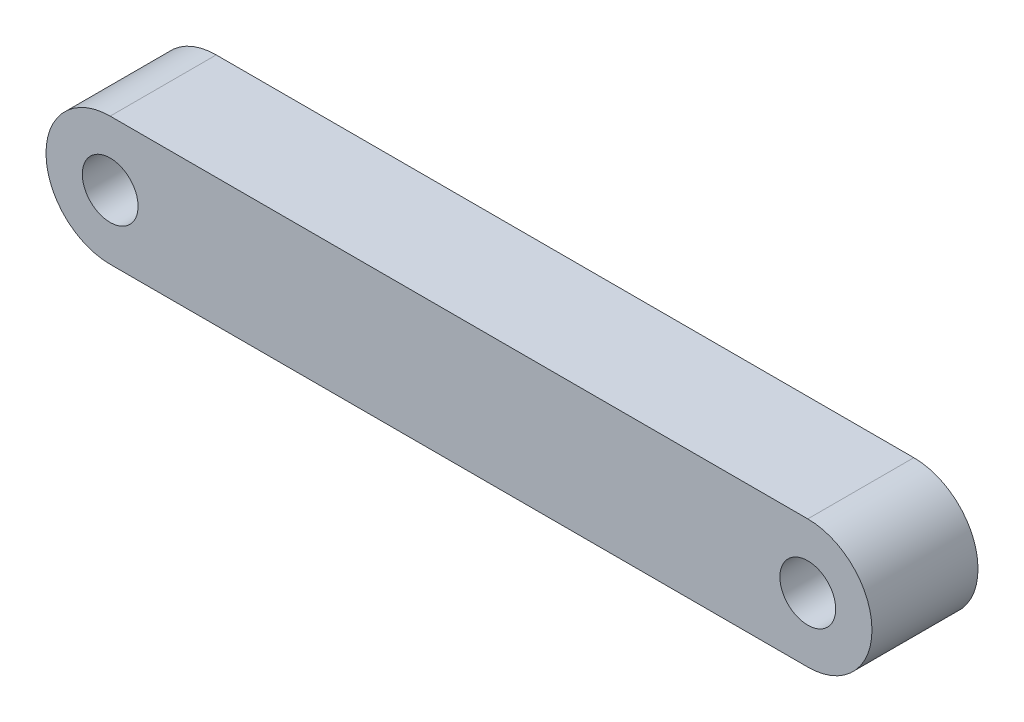
ISO-10303-21;
HEADER;
FILE_DESCRIPTION(('STEP AP214'),'2;1');
FILE_NAME('part.step','',(''),(''),'','','');
FILE_SCHEMA(('AUTOMOTIVE_DESIGN { 1 0 10303 214 1 1 1 1 }'));
ENDSEC;
DATA;
#1=APPLICATION_CONTEXT('core data for automotive mechanical design processes');
#2=APPLICATION_PROTOCOL_DEFINITION('international standard','automotive_design',2000,#1);
#3=PRODUCT_CONTEXT('',#1,'mechanical');
#4=PRODUCT('Part','Part','',(#3));
#5=PRODUCT_RELATED_PRODUCT_CATEGORY('part','',(#4));
#6=PRODUCT_DEFINITION_FORMATION('','',#4);
#7=PRODUCT_DEFINITION_CONTEXT('part definition',#1,'design');
#8=PRODUCT_DEFINITION('design','',#6,#7);
#9=PRODUCT_DEFINITION_SHAPE('','',#8);
#10=(LENGTH_UNIT() NAMED_UNIT(*) SI_UNIT(.MILLI.,.METRE.));
#11=(NAMED_UNIT(*) PLANE_ANGLE_UNIT() SI_UNIT($,.RADIAN.));
#12=(NAMED_UNIT(*) SI_UNIT($,.STERADIAN.) SOLID_ANGLE_UNIT());
#13=UNCERTAINTY_MEASURE_WITH_UNIT(LENGTH_MEASURE(1.E-05),#10,'distance_accuracy_value','');
#14=(GEOMETRIC_REPRESENTATION_CONTEXT(3) GLOBAL_UNCERTAINTY_ASSIGNED_CONTEXT((#13)) GLOBAL_UNIT_ASSIGNED_CONTEXT((#10,
#11,#12)) REPRESENTATION_CONTEXT('',''));
#15=CARTESIAN_POINT('',(0.,0.,0.));
#16=DIRECTION('',(0.,0.,1.));
#17=DIRECTION('',(1.,0.,0.));
#18=AXIS2_PLACEMENT_3D('',#15,#16,#17);
#19=CARTESIAN_POINT('',(0.,0.,3.8));
#20=DIRECTION('',(0.,0.,1.));
#21=DIRECTION('',(1.,0.,0.));
#22=AXIS2_PLACEMENT_3D('',#19,#20,#21);
#23=PLANE('',#22);
#24=CARTESIAN_POINT('',(0.,0.,3.8));
#25=DIRECTION('',(0.,0.,1.));
#26=DIRECTION('',(1.,0.,0.));
#27=AXIS2_PLACEMENT_3D('',#24,#25,#26);
#28=CIRCLE('',#27,1.);
#29=CARTESIAN_POINT('',(-1.,0.,3.8));
#30=VERTEX_POINT('',#29);
#31=EDGE_CURVE('E102',#30,#30,#28,.T.);
#32=ORIENTED_EDGE('',*,*,#31,.F.);
#33=EDGE_LOOP('',(#32));
#34=FACE_BOUND('',#33,.T.);
#35=CARTESIAN_POINT('',(0.,0.,3.8));
#36=DIRECTION('',(0.,0.,1.));
#37=DIRECTION('',(1.,0.,0.));
#38=AXIS2_PLACEMENT_3D('',#35,#36,#37);
#39=CIRCLE('',#38,2.3);
#40=CARTESIAN_POINT('',(0.,2.3,3.8));
#41=VERTEX_POINT('',#40);
#42=CARTESIAN_POINT('',(0.,-2.3,3.8));
#43=VERTEX_POINT('',#42);
#44=EDGE_CURVE('E87',#41,#43,#39,.T.);
#45=ORIENTED_EDGE('',*,*,#44,.T.);
#46=DIRECTION('',(1.,0.,0.));
#47=VECTOR('',#46,1.);
#48=CARTESIAN_POINT('',(0.,-2.3,3.8));
#49=LINE('',#48,#47);
#50=CARTESIAN_POINT('',(25.,-2.3,3.8));
#51=VERTEX_POINT('',#50);
#52=EDGE_CURVE('E82',#43,#51,#49,.T.);
#53=ORIENTED_EDGE('',*,*,#52,.T.);
#54=CARTESIAN_POINT('',(25.,0.,3.8));
#55=DIRECTION('',(0.,0.,1.));
#56=DIRECTION('',(1.,0.,0.));
#57=AXIS2_PLACEMENT_3D('',#54,#55,#56);
#58=CIRCLE('',#57,2.3);
#59=CARTESIAN_POINT('',(25.,2.3,3.8));
#60=VERTEX_POINT('',#59);
#61=EDGE_CURVE('E85',#51,#60,#58,.T.);
#62=ORIENTED_EDGE('',*,*,#61,.T.);
#63=DIRECTION('',(-1.,0.,0.));
#64=VECTOR('',#63,1.);
#65=CARTESIAN_POINT('',(0.,2.3,3.8));
#66=LINE('',#65,#64);
#67=EDGE_CURVE('E52',#60,#41,#66,.T.);
#68=ORIENTED_EDGE('',*,*,#67,.T.);
#69=EDGE_LOOP('',(#45,#53,#62,#68));
#70=FACE_BOUND('',#69,.T.);
#71=CARTESIAN_POINT('',(25.,0.,3.8));
#72=DIRECTION('',(0.,0.,1.));
#73=DIRECTION('',(1.,0.,0.));
#74=AXIS2_PLACEMENT_3D('',#71,#72,#73);
#75=CIRCLE('',#74,1.);
#76=CARTESIAN_POINT('',(24.,0.,3.8));
#77=VERTEX_POINT('',#76);
#78=EDGE_CURVE('E117',#77,#77,#75,.T.);
#79=ORIENTED_EDGE('',*,*,#78,.F.);
#80=EDGE_LOOP('',(#79));
#81=FACE_BOUND('',#80,.T.);
#82=ADVANCED_FACE('F35',(#34,#70,#81),#23,.T.);
#83=CARTESIAN_POINT('',(0.,0.,0.));
#84=DIRECTION('',(0.,0.,1.));
#85=DIRECTION('',(1.,0.,0.));
#86=AXIS2_PLACEMENT_3D('',#83,#84,#85);
#87=PLANE('',#86);
#88=CARTESIAN_POINT('',(0.,0.,0.));
#89=DIRECTION('',(0.,0.,1.));
#90=DIRECTION('',(1.,0.,0.));
#91=AXIS2_PLACEMENT_3D('',#88,#89,#90);
#92=CIRCLE('',#91,2.3);
#93=CARTESIAN_POINT('',(0.,2.3,0.));
#94=VERTEX_POINT('',#93);
#95=CARTESIAN_POINT('',(0.,-2.3,0.));
#96=VERTEX_POINT('',#95);
#97=EDGE_CURVE('E99',#94,#96,#92,.T.);
#98=ORIENTED_EDGE('',*,*,#97,.F.);
#99=DIRECTION('',(-1.,0.,0.));
#100=VECTOR('',#99,1.);
#101=CARTESIAN_POINT('',(0.,2.3,0.));
#102=LINE('',#101,#100);
#103=CARTESIAN_POINT('',(25.,2.3,0.));
#104=VERTEX_POINT('',#103);
#105=EDGE_CURVE('E75',#104,#94,#102,.T.);
#106=ORIENTED_EDGE('',*,*,#105,.F.);
#107=CARTESIAN_POINT('',(25.,0.,0.));
#108=DIRECTION('',(0.,0.,1.));
#109=DIRECTION('',(1.,0.,0.));
#110=AXIS2_PLACEMENT_3D('',#107,#108,#109);
#111=CIRCLE('',#110,2.3);
#112=CARTESIAN_POINT('',(25.,-2.3,0.));
#113=VERTEX_POINT('',#112);
#114=EDGE_CURVE('E69',#113,#104,#111,.T.);
#115=ORIENTED_EDGE('',*,*,#114,.F.);
#116=DIRECTION('',(1.,0.,0.));
#117=VECTOR('',#116,1.);
#118=CARTESIAN_POINT('',(0.,-2.3,0.));
#119=LINE('',#118,#117);
#120=EDGE_CURVE('E91',#96,#113,#119,.T.);
#121=ORIENTED_EDGE('',*,*,#120,.F.);
#122=EDGE_LOOP('',(#98,#106,#115,#121));
#123=FACE_BOUND('',#122,.T.);
#124=CARTESIAN_POINT('',(0.,0.,0.));
#125=DIRECTION('',(0.,0.,1.));
#126=DIRECTION('',(1.,0.,0.));
#127=AXIS2_PLACEMENT_3D('',#124,#125,#126);
#128=CIRCLE('',#127,1.);
#129=CARTESIAN_POINT('',(-1.,0.,0.));
#130=VERTEX_POINT('',#129);
#131=EDGE_CURVE('E114',#130,#130,#128,.T.);
#132=ORIENTED_EDGE('',*,*,#131,.T.);
#133=EDGE_LOOP('',(#132));
#134=FACE_BOUND('',#133,.T.);
#135=CARTESIAN_POINT('',(25.,0.,0.));
#136=DIRECTION('',(0.,0.,1.));
#137=DIRECTION('',(1.,0.,0.));
#138=AXIS2_PLACEMENT_3D('',#135,#136,#137);
#139=CIRCLE('',#138,1.);
#140=CARTESIAN_POINT('',(24.,0.,0.));
#141=VERTEX_POINT('',#140);
#142=EDGE_CURVE('E120',#141,#141,#139,.T.);
#143=ORIENTED_EDGE('',*,*,#142,.T.);
#144=EDGE_LOOP('',(#143));
#145=FACE_BOUND('',#144,.T.);
#146=ADVANCED_FACE('F110',(#123,#134,#145),#87,.F.);
#147=CARTESIAN_POINT('',(0.,0.,3.8));
#148=DIRECTION('',(0.,0.,-1.));
#149=DIRECTION('',(-1.,0.,0.));
#150=AXIS2_PLACEMENT_3D('',#147,#148,#149);
#151=CYLINDRICAL_SURFACE('',#150,2.3);
#152=ORIENTED_EDGE('',*,*,#97,.T.);
#153=DIRECTION('',(0.,0.,-1.));
#154=VECTOR('',#153,1.);
#155=CARTESIAN_POINT('',(0.,-2.3,3.8));
#156=LINE('',#155,#154);
#157=EDGE_CURVE('E11',#43,#96,#156,.T.);
#158=ORIENTED_EDGE('',*,*,#157,.F.);
#159=ORIENTED_EDGE('',*,*,#44,.F.);
#160=DIRECTION('',(0.,0.,-1.));
#161=VECTOR('',#160,1.);
#162=CARTESIAN_POINT('',(0.,2.3,3.8));
#163=LINE('',#162,#161);
#164=EDGE_CURVE('E95',#41,#94,#163,.T.);
#165=ORIENTED_EDGE('',*,*,#164,.T.);
#166=EDGE_LOOP('',(#152,#158,#159,#165));
#167=FACE_BOUND('',#166,.T.);
#168=ADVANCED_FACE('F37',(#167),#151,.T.);
#169=CARTESIAN_POINT('',(0.,-2.3,3.8));
#170=DIRECTION('',(0.,1.,0.));
#171=DIRECTION('',(-1.,0.,0.));
#172=AXIS2_PLACEMENT_3D('',#169,#170,#171);
#173=PLANE('',#172);
#174=ORIENTED_EDGE('',*,*,#120,.T.);
#175=DIRECTION('',(0.,0.,-1.));
#176=VECTOR('',#175,1.);
#177=CARTESIAN_POINT('',(25.,-2.3,3.8));
#178=LINE('',#177,#176);
#179=EDGE_CURVE('E44',#51,#113,#178,.T.);
#180=ORIENTED_EDGE('',*,*,#179,.F.);
#181=ORIENTED_EDGE('',*,*,#52,.F.);
#182=ORIENTED_EDGE('',*,*,#157,.T.);
#183=EDGE_LOOP('',(#174,#180,#181,#182));
#184=FACE_BOUND('',#183,.T.);
#185=ADVANCED_FACE('F90',(#184),#173,.F.);
#186=CARTESIAN_POINT('',(25.,0.,3.8));
#187=DIRECTION('',(0.,0.,-1.));
#188=DIRECTION('',(-1.,0.,0.));
#189=AXIS2_PLACEMENT_3D('',#186,#187,#188);
#190=CYLINDRICAL_SURFACE('',#189,2.3);
#191=ORIENTED_EDGE('',*,*,#114,.T.);
#192=DIRECTION('',(0.,0.,-1.));
#193=VECTOR('',#192,1.);
#194=CARTESIAN_POINT('',(25.,2.3,3.8));
#195=LINE('',#194,#193);
#196=EDGE_CURVE('E92',#60,#104,#195,.T.);
#197=ORIENTED_EDGE('',*,*,#196,.F.);
#198=ORIENTED_EDGE('',*,*,#61,.F.);
#199=ORIENTED_EDGE('',*,*,#179,.T.);
#200=EDGE_LOOP('',(#191,#197,#198,#199));
#201=FACE_BOUND('',#200,.T.);
#202=ADVANCED_FACE('F93',(#201),#190,.T.);
#203=CARTESIAN_POINT('',(0.,2.3,3.8));
#204=DIRECTION('',(0.,-1.,0.));
#205=DIRECTION('',(1.,0.,0.));
#206=AXIS2_PLACEMENT_3D('',#203,#204,#205);
#207=PLANE('',#206);
#208=ORIENTED_EDGE('',*,*,#105,.T.);
#209=ORIENTED_EDGE('',*,*,#164,.F.);
#210=ORIENTED_EDGE('',*,*,#67,.F.);
#211=ORIENTED_EDGE('',*,*,#196,.T.);
#212=EDGE_LOOP('',(#208,#209,#210,#211));
#213=FACE_BOUND('',#212,.T.);
#214=ADVANCED_FACE('F107',(#213),#207,.F.);
#215=CARTESIAN_POINT('',(0.,0.,3.8));
#216=DIRECTION('',(0.,0.,-1.));
#217=DIRECTION('',(-1.,0.,0.));
#218=AXIS2_PLACEMENT_3D('',#215,#216,#217);
#219=CYLINDRICAL_SURFACE('',#218,1.);
#220=CARTESIAN_POINT('',(-1.,0.,3.8));
#221=CARTESIAN_POINT('',(-1.,0.,3.76041666666667));
#222=CARTESIAN_POINT('',(-1.,0.,3.72083333333333));
#223=CARTESIAN_POINT('',(-1.,0.,3.64166666666667));
#224=CARTESIAN_POINT('',(-1.,0.,3.60208333333333));
#225=CARTESIAN_POINT('',(-1.,0.,3.52291666666667));
#226=CARTESIAN_POINT('',(-1.,0.,3.48333333333333));
#227=CARTESIAN_POINT('',(-1.,0.,3.40416666666667));
#228=CARTESIAN_POINT('',(-1.,0.,3.36458333333333));
#229=CARTESIAN_POINT('',(-1.,0.,3.28541666666667));
#230=CARTESIAN_POINT('',(-1.,0.,3.24583333333333));
#231=CARTESIAN_POINT('',(-1.,0.,3.16666666666667));
#232=CARTESIAN_POINT('',(-1.,0.,3.12708333333333));
#233=CARTESIAN_POINT('',(-1.,0.,3.04791666666667));
#234=CARTESIAN_POINT('',(-1.,0.,3.00833333333333));
#235=CARTESIAN_POINT('',(-1.,0.,2.92916666666667));
#236=CARTESIAN_POINT('',(-1.,0.,2.88958333333333));
#237=CARTESIAN_POINT('',(-1.,0.,2.81041666666667));
#238=CARTESIAN_POINT('',(-1.,0.,2.77083333333333));
#239=CARTESIAN_POINT('',(-1.,0.,2.69166666666667));
#240=CARTESIAN_POINT('',(-1.,0.,2.65208333333333));
#241=CARTESIAN_POINT('',(-1.,0.,2.57291666666667));
#242=CARTESIAN_POINT('',(-1.,0.,2.53333333333333));
#243=CARTESIAN_POINT('',(-1.,0.,2.45416666666667));
#244=CARTESIAN_POINT('',(-1.,0.,2.41458333333333));
#245=CARTESIAN_POINT('',(-1.,0.,2.33541666666667));
#246=CARTESIAN_POINT('',(-1.,0.,2.29583333333333));
#247=CARTESIAN_POINT('',(-1.,0.,2.21666666666667));
#248=CARTESIAN_POINT('',(-1.,0.,2.17708333333333));
#249=CARTESIAN_POINT('',(-1.,0.,2.09791666666667));
#250=CARTESIAN_POINT('',(-1.,0.,2.05833333333333));
#251=CARTESIAN_POINT('',(-1.,0.,1.97916666666667));
#252=CARTESIAN_POINT('',(-1.,0.,1.93958333333333));
#253=CARTESIAN_POINT('',(-1.,0.,1.86041666666667));
#254=CARTESIAN_POINT('',(-1.,0.,1.82083333333333));
#255=CARTESIAN_POINT('',(-1.,0.,1.74166666666667));
#256=CARTESIAN_POINT('',(-1.,0.,1.70208333333333));
#257=CARTESIAN_POINT('',(-1.,0.,1.62291666666667));
#258=CARTESIAN_POINT('',(-1.,0.,1.58333333333333));
#259=CARTESIAN_POINT('',(-1.,0.,1.50416666666667));
#260=CARTESIAN_POINT('',(-1.,0.,1.46458333333333));
#261=CARTESIAN_POINT('',(-1.,0.,1.38541666666667));
#262=CARTESIAN_POINT('',(-1.,0.,1.34583333333333));
#263=CARTESIAN_POINT('',(-1.,0.,1.26666666666667));
#264=CARTESIAN_POINT('',(-1.,0.,1.22708333333333));
#265=CARTESIAN_POINT('',(-1.,0.,1.14791666666667));
#266=CARTESIAN_POINT('',(-1.,0.,1.10833333333333));
#267=CARTESIAN_POINT('',(-1.,0.,1.02916666666667));
#268=CARTESIAN_POINT('',(-1.,0.,0.989583333333333));
#269=CARTESIAN_POINT('',(-1.,0.,0.910416666666667));
#270=CARTESIAN_POINT('',(-1.,0.,0.870833333333333));
#271=CARTESIAN_POINT('',(-1.,0.,0.791666666666667));
#272=CARTESIAN_POINT('',(-1.,0.,0.752083333333333));
#273=CARTESIAN_POINT('',(-1.,0.,0.672916666666667));
#274=CARTESIAN_POINT('',(-1.,0.,0.633333333333333));
#275=CARTESIAN_POINT('',(-1.,0.,0.554166666666667));
#276=CARTESIAN_POINT('',(-1.,0.,0.514583333333334));
#277=CARTESIAN_POINT('',(-1.,0.,0.435416666666667));
#278=CARTESIAN_POINT('',(-1.,0.,0.395833333333333));
#279=CARTESIAN_POINT('',(-1.,0.,0.316666666666666));
#280=CARTESIAN_POINT('',(-1.,0.,0.277083333333333));
#281=CARTESIAN_POINT('',(-1.,0.,0.197916666666667));
#282=CARTESIAN_POINT('',(-1.,0.,0.158333333333333));
#283=CARTESIAN_POINT('',(-1.,0.,0.0791666666666666));
#284=CARTESIAN_POINT('',(-1.,0.,0.0395833333333333));
#285=CARTESIAN_POINT('',(-1.,0.,0.));
#286=B_SPLINE_CURVE_WITH_KNOTS('',3,(#220,#221,#222,#223,#224,#225,#226,#227,#228,#229,#230,
#231,#232,#233,#234,#235,#236,#237,#238,#239,#240,#241,#242,#243,#244,#245,#246,#247,#248,#249,
#250,#251,#252,#253,#254,#255,#256,#257,#258,#259,#260,#261,#262,#263,#264,#265,#266,#267,#268,
#269,#270,#271,#272,#273,#274,#275,#276,#277,#278,#279,#280,#281,#282,#283,#284,#285),
.UNSPECIFIED.,.F.,.F.,(4,2,2,2,2,2,2,2,2,2,2,2,2,2,2,2,2,2,2,2,2,2,2,2,2,2,2,2,2,2,2,2,4),(0.,
0.11875,0.2375,0.35625,0.475,0.59375,0.7125,0.831249999999999,0.95,1.06875,1.1875,1.30625,1.425,
1.54375,1.6625,1.78125,1.9,2.01875,2.1375,2.25625,2.375,2.49375,2.6125,2.73125,2.85,2.96875,
3.0875,3.20625,3.325,3.44375,3.5625,3.68125,3.8),.UNSPECIFIED.);
#287=EDGE_CURVE('BSEAM137',#30,#130,#286,.T.);
#288=ORIENTED_EDGE('',*,*,#31,.T.);
#289=ORIENTED_EDGE('',*,*,#131,.F.);
#290=ORIENTED_EDGE('',*,*,#287,.T.);
#291=ORIENTED_EDGE('',*,*,#287,.F.);
#292=EDGE_LOOP('',(#288,#290,#289,#291));
#293=FACE_BOUND('',#292,.T.);
#294=ADVANCED_FACE('F137',(#293),#219,.F.);
#295=CARTESIAN_POINT('',(25.,0.,3.8));
#296=DIRECTION('',(0.,0.,-1.));
#297=DIRECTION('',(-1.,0.,0.));
#298=AXIS2_PLACEMENT_3D('',#295,#296,#297);
#299=CYLINDRICAL_SURFACE('',#298,1.);
#300=CARTESIAN_POINT('',(24.,0.,3.8));
#301=CARTESIAN_POINT('',(24.,0.,3.76041666666667));
#302=CARTESIAN_POINT('',(24.,0.,3.72083333333333));
#303=CARTESIAN_POINT('',(24.,0.,3.64166666666667));
#304=CARTESIAN_POINT('',(24.,0.,3.60208333333333));
#305=CARTESIAN_POINT('',(24.,0.,3.52291666666667));
#306=CARTESIAN_POINT('',(24.,0.,3.48333333333333));
#307=CARTESIAN_POINT('',(24.,0.,3.40416666666667));
#308=CARTESIAN_POINT('',(24.,0.,3.36458333333333));
#309=CARTESIAN_POINT('',(24.,0.,3.28541666666667));
#310=CARTESIAN_POINT('',(24.,0.,3.24583333333333));
#311=CARTESIAN_POINT('',(24.,0.,3.16666666666667));
#312=CARTESIAN_POINT('',(24.,0.,3.12708333333333));
#313=CARTESIAN_POINT('',(24.,0.,3.04791666666667));
#314=CARTESIAN_POINT('',(24.,0.,3.00833333333333));
#315=CARTESIAN_POINT('',(24.,0.,2.92916666666667));
#316=CARTESIAN_POINT('',(24.,0.,2.88958333333333));
#317=CARTESIAN_POINT('',(24.,0.,2.81041666666667));
#318=CARTESIAN_POINT('',(24.,0.,2.77083333333333));
#319=CARTESIAN_POINT('',(24.,0.,2.69166666666667));
#320=CARTESIAN_POINT('',(24.,0.,2.65208333333333));
#321=CARTESIAN_POINT('',(24.,0.,2.57291666666667));
#322=CARTESIAN_POINT('',(24.,0.,2.53333333333333));
#323=CARTESIAN_POINT('',(24.,0.,2.45416666666667));
#324=CARTESIAN_POINT('',(24.,0.,2.41458333333333));
#325=CARTESIAN_POINT('',(24.,0.,2.33541666666667));
#326=CARTESIAN_POINT('',(24.,0.,2.29583333333333));
#327=CARTESIAN_POINT('',(24.,0.,2.21666666666667));
#328=CARTESIAN_POINT('',(24.,0.,2.17708333333333));
#329=CARTESIAN_POINT('',(24.,0.,2.09791666666667));
#330=CARTESIAN_POINT('',(24.,0.,2.05833333333333));
#331=CARTESIAN_POINT('',(24.,0.,1.97916666666667));
#332=CARTESIAN_POINT('',(24.,0.,1.93958333333333));
#333=CARTESIAN_POINT('',(24.,0.,1.86041666666667));
#334=CARTESIAN_POINT('',(24.,0.,1.82083333333333));
#335=CARTESIAN_POINT('',(24.,0.,1.74166666666667));
#336=CARTESIAN_POINT('',(24.,0.,1.70208333333333));
#337=CARTESIAN_POINT('',(24.,0.,1.62291666666667));
#338=CARTESIAN_POINT('',(24.,0.,1.58333333333333));
#339=CARTESIAN_POINT('',(24.,0.,1.50416666666667));
#340=CARTESIAN_POINT('',(24.,0.,1.46458333333333));
#341=CARTESIAN_POINT('',(24.,0.,1.38541666666667));
#342=CARTESIAN_POINT('',(24.,0.,1.34583333333333));
#343=CARTESIAN_POINT('',(24.,0.,1.26666666666667));
#344=CARTESIAN_POINT('',(24.,0.,1.22708333333333));
#345=CARTESIAN_POINT('',(24.,0.,1.14791666666667));
#346=CARTESIAN_POINT('',(24.,0.,1.10833333333333));
#347=CARTESIAN_POINT('',(24.,0.,1.02916666666667));
#348=CARTESIAN_POINT('',(24.,0.,0.989583333333333));
#349=CARTESIAN_POINT('',(24.,0.,0.910416666666667));
#350=CARTESIAN_POINT('',(24.,0.,0.870833333333333));
#351=CARTESIAN_POINT('',(24.,0.,0.791666666666667));
#352=CARTESIAN_POINT('',(24.,0.,0.752083333333333));
#353=CARTESIAN_POINT('',(24.,0.,0.672916666666667));
#354=CARTESIAN_POINT('',(24.,0.,0.633333333333333));
#355=CARTESIAN_POINT('',(24.,0.,0.554166666666667));
#356=CARTESIAN_POINT('',(24.,0.,0.514583333333334));
#357=CARTESIAN_POINT('',(24.,0.,0.435416666666667));
#358=CARTESIAN_POINT('',(24.,0.,0.395833333333333));
#359=CARTESIAN_POINT('',(24.,0.,0.316666666666666));
#360=CARTESIAN_POINT('',(24.,0.,0.277083333333333));
#361=CARTESIAN_POINT('',(24.,0.,0.197916666666667));
#362=CARTESIAN_POINT('',(24.,0.,0.158333333333333));
#363=CARTESIAN_POINT('',(24.,0.,0.0791666666666666));
#364=CARTESIAN_POINT('',(24.,0.,0.0395833333333333));
#365=CARTESIAN_POINT('',(24.,0.,0.));
#366=B_SPLINE_CURVE_WITH_KNOTS('',3,(#300,#301,#302,#303,#304,#305,#306,#307,#308,#309,#310,
#311,#312,#313,#314,#315,#316,#317,#318,#319,#320,#321,#322,#323,#324,#325,#326,#327,#328,#329,
#330,#331,#332,#333,#334,#335,#336,#337,#338,#339,#340,#341,#342,#343,#344,#345,#346,#347,#348,
#349,#350,#351,#352,#353,#354,#355,#356,#357,#358,#359,#360,#361,#362,#363,#364,#365),
.UNSPECIFIED.,.F.,.F.,(4,2,2,2,2,2,2,2,2,2,2,2,2,2,2,2,2,2,2,2,2,2,2,2,2,2,2,2,2,2,2,2,4),(0.,
0.11875,0.2375,0.35625,0.475,0.59375,0.7125,0.831249999999999,0.95,1.06875,1.1875,1.30625,1.425,
1.54375,1.6625,1.78125,1.9,2.01875,2.1375,2.25625,2.375,2.49375,2.6125,2.73125,2.85,2.96875,
3.0875,3.20625,3.325,3.44375,3.5625,3.68125,3.8),.UNSPECIFIED.);
#367=EDGE_CURVE('BSEAM126',#77,#141,#366,.T.);
#368=ORIENTED_EDGE('',*,*,#78,.T.);
#369=ORIENTED_EDGE('',*,*,#142,.F.);
#370=ORIENTED_EDGE('',*,*,#367,.T.);
#371=ORIENTED_EDGE('',*,*,#367,.F.);
#372=EDGE_LOOP('',(#368,#370,#369,#371));
#373=FACE_BOUND('',#372,.T.);
#374=ADVANCED_FACE('F126',(#373),#299,.F.);
#375=CLOSED_SHELL('',(#82,#146,#168,#185,#202,#214,#294,#374));
#376=MANIFOLD_SOLID_BREP('B2',#375);
#377=ADVANCED_BREP_SHAPE_REPRESENTATION('',(#18,#376),#14);
#378=SHAPE_DEFINITION_REPRESENTATION(#9,#377);
ENDSEC;
END-ISO-10303-21;
